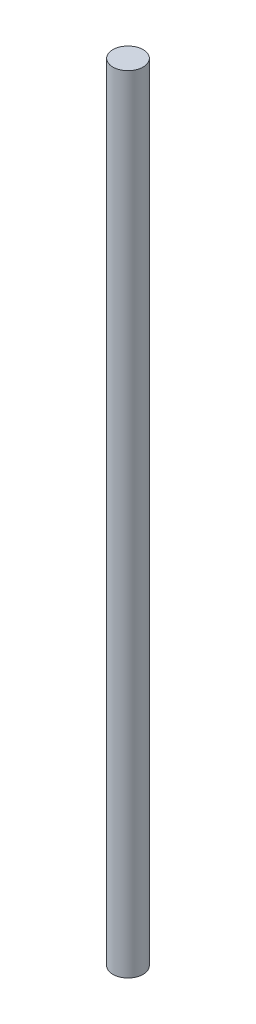
ISO-10303-21;
HEADER;
FILE_DESCRIPTION(('STEP AP214'),'2;1');
FILE_NAME('part.step','',(''),(''),'','','');
FILE_SCHEMA(('AUTOMOTIVE_DESIGN { 1 0 10303 214 1 1 1 1 }'));
ENDSEC;
DATA;
#1=APPLICATION_CONTEXT('core data for automotive mechanical design processes');
#2=APPLICATION_PROTOCOL_DEFINITION('international standard','automotive_design',2000,#1);
#3=PRODUCT_CONTEXT('',#1,'mechanical');
#4=PRODUCT('Part','Part','',(#3));
#5=PRODUCT_RELATED_PRODUCT_CATEGORY('part','',(#4));
#6=PRODUCT_DEFINITION_FORMATION('','',#4);
#7=PRODUCT_DEFINITION_CONTEXT('part definition',#1,'design');
#8=PRODUCT_DEFINITION('design','',#6,#7);
#9=PRODUCT_DEFINITION_SHAPE('','',#8);
#10=(LENGTH_UNIT() NAMED_UNIT(*) SI_UNIT(.MILLI.,.METRE.));
#11=(NAMED_UNIT(*) PLANE_ANGLE_UNIT() SI_UNIT($,.RADIAN.));
#12=(NAMED_UNIT(*) SI_UNIT($,.STERADIAN.) SOLID_ANGLE_UNIT());
#13=UNCERTAINTY_MEASURE_WITH_UNIT(LENGTH_MEASURE(1.E-05),#10,'distance_accuracy_value','');
#14=(GEOMETRIC_REPRESENTATION_CONTEXT(3) GLOBAL_UNCERTAINTY_ASSIGNED_CONTEXT((#13)) GLOBAL_UNIT_ASSIGNED_CONTEXT((#10,
#11,#12)) REPRESENTATION_CONTEXT('',''));
#15=CARTESIAN_POINT('',(0.,0.,0.));
#16=DIRECTION('',(0.,0.,1.));
#17=DIRECTION('',(1.,0.,0.));
#18=AXIS2_PLACEMENT_3D('',#15,#16,#17);
#19=CARTESIAN_POINT('',(0.,78.,0.));
#20=DIRECTION('',(0.,-1.,0.));
#21=DIRECTION('',(0.,0.,-1.));
#22=AXIS2_PLACEMENT_3D('',#19,#20,#21);
#23=CYLINDRICAL_SURFACE('',#22,1.5);
#24=CARTESIAN_POINT('',(0.,78.,0.));
#25=DIRECTION('',(0.,1.,0.));
#26=DIRECTION('',(0.,0.,1.));
#27=AXIS2_PLACEMENT_3D('',#24,#25,#26);
#28=CIRCLE('',#27,1.5);
#29=CARTESIAN_POINT('',(0.,78.,1.5));
#30=VERTEX_POINT('',#29);
#31=EDGE_CURVE('E10',#30,#30,#28,.T.);
#32=ORIENTED_EDGE('',*,*,#31,.F.);
#33=EDGE_LOOP('',(#32));
#34=FACE_BOUND('',#33,.T.);
#35=CARTESIAN_POINT('',(0.,0.,0.));
#36=DIRECTION('',(0.,1.,0.));
#37=DIRECTION('',(0.,0.,1.));
#38=AXIS2_PLACEMENT_3D('',#35,#36,#37);
#39=CIRCLE('',#38,1.5);
#40=CARTESIAN_POINT('',(0.,0.,1.5));
#41=VERTEX_POINT('',#40);
#42=EDGE_CURVE('E40',#41,#41,#39,.T.);
#43=ORIENTED_EDGE('',*,*,#42,.T.);
#44=EDGE_LOOP('',(#43));
#45=FACE_BOUND('',#44,.T.);
#46=ADVANCED_FACE('F37',(#34,#45),#23,.T.);
#47=CARTESIAN_POINT('',(0.,78.,0.));
#48=DIRECTION('',(0.,1.,0.));
#49=DIRECTION('',(0.,0.,1.));
#50=AXIS2_PLACEMENT_3D('',#47,#48,#49);
#51=PLANE('',#50);
#52=ORIENTED_EDGE('',*,*,#31,.T.);
#53=EDGE_LOOP('',(#52));
#54=FACE_BOUND('',#53,.T.);
#55=ADVANCED_FACE('F54',(#54),#51,.T.);
#56=CARTESIAN_POINT('',(0.,0.,0.));
#57=DIRECTION('',(0.,1.,0.));
#58=DIRECTION('',(0.,0.,1.));
#59=AXIS2_PLACEMENT_3D('',#56,#57,#58);
#60=PLANE('',#59);
#61=ORIENTED_EDGE('',*,*,#42,.F.);
#62=EDGE_LOOP('',(#61));
#63=FACE_BOUND('',#62,.T.);
#64=ADVANCED_FACE('F52',(#63),#60,.F.);
#65=CLOSED_SHELL('',(#46,#55,#64));
#66=MANIFOLD_SOLID_BREP('B2',#65);
#67=ADVANCED_BREP_SHAPE_REPRESENTATION('',(#18,#66),#14);
#68=SHAPE_DEFINITION_REPRESENTATION(#9,#67);
ENDSEC;
END-ISO-10303-21;
